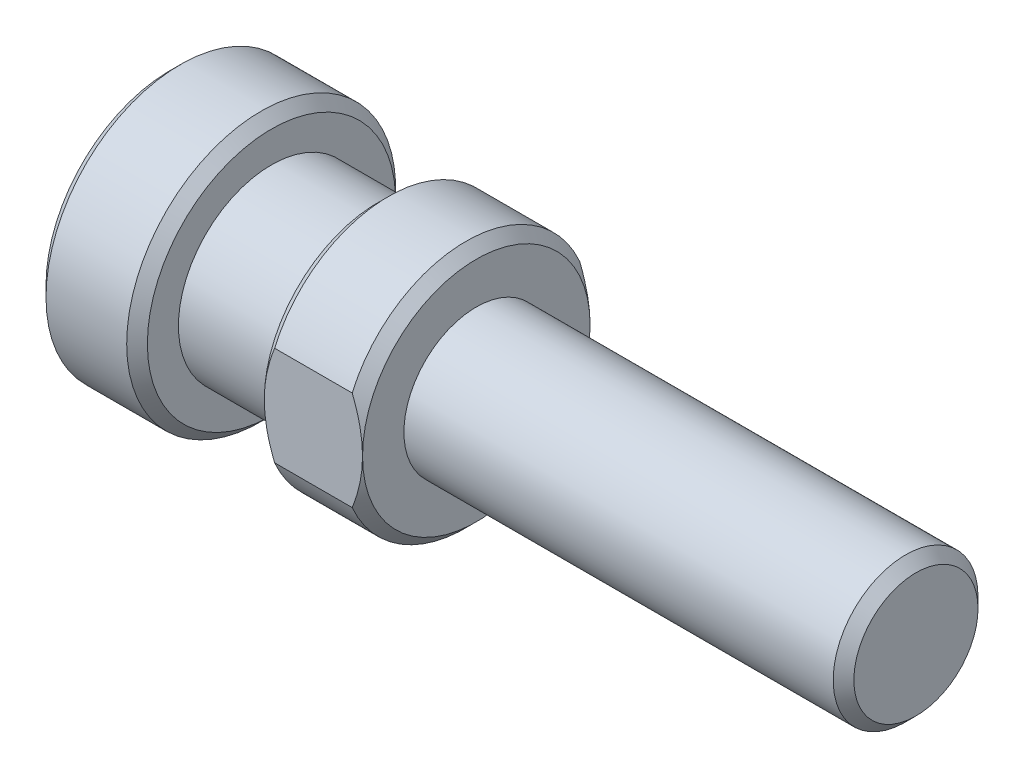
ISO-10303-21;
HEADER;
FILE_DESCRIPTION(('STEP AP214'),'2;1');
FILE_NAME('part.step','',(''),(''),'','','');
FILE_SCHEMA(('AUTOMOTIVE_DESIGN { 1 0 10303 214 1 1 1 1 }'));
ENDSEC;
DATA;
#1=APPLICATION_CONTEXT('core data for automotive mechanical design processes');
#2=APPLICATION_PROTOCOL_DEFINITION('international standard','automotive_design',2000,#1);
#3=PRODUCT_CONTEXT('',#1,'mechanical');
#4=PRODUCT('Part','Part','',(#3));
#5=PRODUCT_RELATED_PRODUCT_CATEGORY('part','',(#4));
#6=PRODUCT_DEFINITION_FORMATION('','',#4);
#7=PRODUCT_DEFINITION_CONTEXT('part definition',#1,'design');
#8=PRODUCT_DEFINITION('design','',#6,#7);
#9=PRODUCT_DEFINITION_SHAPE('','',#8);
#10=(LENGTH_UNIT() NAMED_UNIT(*) SI_UNIT(.MILLI.,.METRE.));
#11=(NAMED_UNIT(*) PLANE_ANGLE_UNIT() SI_UNIT($,.RADIAN.));
#12=(NAMED_UNIT(*) SI_UNIT($,.STERADIAN.) SOLID_ANGLE_UNIT());
#13=UNCERTAINTY_MEASURE_WITH_UNIT(LENGTH_MEASURE(1.E-05),#10,'distance_accuracy_value','');
#14=(GEOMETRIC_REPRESENTATION_CONTEXT(3) GLOBAL_UNCERTAINTY_ASSIGNED_CONTEXT((#13)) GLOBAL_UNIT_ASSIGNED_CONTEXT((#10,
#11,#12)) REPRESENTATION_CONTEXT('',''));
#15=CARTESIAN_POINT('',(0.,0.,0.));
#16=DIRECTION('',(0.,0.,1.));
#17=DIRECTION('',(1.,0.,0.));
#18=AXIS2_PLACEMENT_3D('',#15,#16,#17);
#19=CARTESIAN_POINT('',(9.50000000000001,0.,0.));
#20=DIRECTION('',(-1.,0.,0.));
#21=DIRECTION('',(0.,0.,1.));
#22=AXIS2_PLACEMENT_3D('',#19,#20,#21);
#23=CYLINDRICAL_SURFACE('',#22,12.);
#24=DIRECTION('',(-1.,0.,0.));
#25=VECTOR('',#24,1.);
#26=CARTESIAN_POINT('',(9.50000000000001,4.79583152331262,-11.));
#27=LINE('',#26,#25);
#28=CARTESIAN_POINT('',(8.50000000000001,4.79583152331262,-11.));
#29=VERTEX_POINT('',#28);
#30=CARTESIAN_POINT('',(0.999999999999973,4.79583152331262,-11.0000000000001));
#31=VERTEX_POINT('',#30);
#32=EDGE_CURVE('E105',#29,#31,#27,.T.);
#33=ORIENTED_EDGE('',*,*,#32,.T.);
#34=CARTESIAN_POINT('',(1.,0.,0.));
#35=DIRECTION('',(1.,0.,0.));
#36=DIRECTION('',(0.,0.,-1.));
#37=AXIS2_PLACEMENT_3D('',#34,#35,#36);
#38=CIRCLE('',#37,12.);
#39=CARTESIAN_POINT('',(1.,4.79583152331259,10.9999999999999));
#40=VERTEX_POINT('',#39);
#41=EDGE_CURVE('E184',#31,#40,#38,.T.);
#42=ORIENTED_EDGE('',*,*,#41,.T.);
#43=DIRECTION('',(-1.,0.,0.));
#44=VECTOR('',#43,1.);
#45=CARTESIAN_POINT('',(9.50000000000001,4.79583152331262,11.));
#46=LINE('',#45,#44);
#47=CARTESIAN_POINT('',(8.50000000000001,4.79583152331262,11.));
#48=VERTEX_POINT('',#47);
#49=EDGE_CURVE('E243',#40,#48,#46,.F.);
#50=ORIENTED_EDGE('',*,*,#49,.T.);
#51=CARTESIAN_POINT('',(8.50000000000001,0.,0.));
#52=DIRECTION('',(1.,0.,0.));
#53=DIRECTION('',(0.,0.,-1.));
#54=AXIS2_PLACEMENT_3D('',#51,#52,#53);
#55=CIRCLE('',#54,12.);
#56=EDGE_CURVE('E182',#48,#29,#55,.F.);
#57=ORIENTED_EDGE('',*,*,#56,.T.);
#58=EDGE_LOOP('',(#33,#42,#50,#57));
#59=FACE_BOUND('',#58,.T.);
#60=ADVANCED_FACE('F34',(#59),#23,.T.);
#61=CARTESIAN_POINT('',(0.,0.,0.));
#62=DIRECTION('',(1.,0.,0.));
#63=DIRECTION('',(0.,0.,-1.));
#64=AXIS2_PLACEMENT_3D('',#61,#62,#63);
#65=PLANE('',#64);
#66=CARTESIAN_POINT('',(0.,0.,0.));
#67=DIRECTION('',(1.,0.,0.));
#68=DIRECTION('',(0.,0.,-1.));
#69=AXIS2_PLACEMENT_3D('',#66,#67,#68);
#70=CIRCLE('',#69,11.);
#71=CARTESIAN_POINT('',(0.,-1.11022302462516E-13,10.9999999999999));
#72=VERTEX_POINT('',#71);
#73=CARTESIAN_POINT('',(0.,-1.11022302462516E-13,-11.0000000000001));
#74=VERTEX_POINT('',#73);
#75=EDGE_CURVE('E179',#72,#74,#70,.F.);
#76=ORIENTED_EDGE('',*,*,#75,.T.);
#77=CARTESIAN_POINT('',(0.,0.,0.));
#78=DIRECTION('',(1.,0.,0.));
#79=DIRECTION('',(0.,0.,-1.));
#80=AXIS2_PLACEMENT_3D('',#77,#78,#79);
#81=CIRCLE('',#80,11.);
#82=EDGE_CURVE('E48',#74,#72,#81,.F.);
#83=ORIENTED_EDGE('',*,*,#82,.T.);
#84=EDGE_LOOP('',(#76,#83));
#85=FACE_BOUND('',#84,.T.);
#86=CARTESIAN_POINT('',(0.,0.,0.));
#87=DIRECTION('',(1.,0.,0.));
#88=DIRECTION('',(0.,0.,-1.));
#89=AXIS2_PLACEMENT_3D('',#86,#87,#88);
#90=CIRCLE('',#89,9.);
#91=CARTESIAN_POINT('',(0.,0.,-9.00000000000006));
#92=VERTEX_POINT('',#91);
#93=EDGE_CURVE('E262',#92,#92,#90,.F.);
#94=ORIENTED_EDGE('',*,*,#93,.F.);
#95=EDGE_LOOP('',(#94));
#96=FACE_BOUND('',#95,.T.);
#97=ADVANCED_FACE('F213',(#85,#96),#65,.F.);
#98=CARTESIAN_POINT('',(9.50000000000001,0.,0.));
#99=DIRECTION('',(1.,0.,0.));
#100=DIRECTION('',(0.,0.,-1.));
#101=AXIS2_PLACEMENT_3D('',#98,#99,#100);
#102=PLANE('',#101);
#103=CARTESIAN_POINT('',(9.50000000000001,0.,0.));
#104=DIRECTION('',(1.,0.,0.));
#105=DIRECTION('',(0.,0.,-1.));
#106=AXIS2_PLACEMENT_3D('',#103,#104,#105);
#107=CIRCLE('',#106,11.);
#108=CARTESIAN_POINT('',(9.50000000000001,-1.11022302462516E-13,-11.));
#109=VERTEX_POINT('',#108);
#110=CARTESIAN_POINT('',(9.50000000000001,-1.11022302462516E-13,11.));
#111=VERTEX_POINT('',#110);
#112=EDGE_CURVE('E114',#109,#111,#107,.T.);
#113=ORIENTED_EDGE('',*,*,#112,.T.);
#114=CARTESIAN_POINT('',(9.50000000000001,0.,0.));
#115=DIRECTION('',(1.,0.,0.));
#116=DIRECTION('',(0.,0.,-1.));
#117=AXIS2_PLACEMENT_3D('',#114,#115,#116);
#118=CIRCLE('',#117,11.);
#119=EDGE_CURVE('E93',#111,#109,#118,.T.);
#120=ORIENTED_EDGE('',*,*,#119,.T.);
#121=EDGE_LOOP('',(#113,#120));
#122=FACE_BOUND('',#121,.T.);
#123=CARTESIAN_POINT('',(9.50000000000001,0.,0.));
#124=DIRECTION('',(1.,0.,0.));
#125=DIRECTION('',(0.,0.,-1.));
#126=AXIS2_PLACEMENT_3D('',#123,#124,#125);
#127=CIRCLE('',#126,7.);
#128=CARTESIAN_POINT('',(9.50000000000001,0.,-7.00000000000001));
#129=VERTEX_POINT('',#128);
#130=EDGE_CURVE('E261',#129,#129,#127,.T.);
#131=ORIENTED_EDGE('',*,*,#130,.F.);
#132=EDGE_LOOP('',(#131));
#133=FACE_BOUND('',#132,.T.);
#134=ADVANCED_FACE('F112',(#122,#133),#102,.T.);
#135=DIRECTION('',(-1.,0.,0.));
#136=VECTOR('',#135,1.);
#137=CARTESIAN_POINT('',(9.50000000000001,-4.79583152331284,-11.));
#138=LINE('',#137,#136);
#139=CARTESIAN_POINT('',(0.999999999999973,-4.79583152331284,-11.0000000000001));
#140=VERTEX_POINT('',#139);
#141=CARTESIAN_POINT('',(8.50000000000001,-4.79583152331284,-11.));
#142=VERTEX_POINT('',#141);
#143=EDGE_CURVE('E234',#140,#142,#138,.F.);
#144=ORIENTED_EDGE('',*,*,#143,.T.);
#145=CARTESIAN_POINT('',(8.50000000000001,0.,0.));
#146=DIRECTION('',(1.,0.,0.));
#147=DIRECTION('',(0.,0.,-1.));
#148=AXIS2_PLACEMENT_3D('',#145,#146,#147);
#149=CIRCLE('',#148,12.);
#150=CARTESIAN_POINT('',(8.50000000000001,-4.79583152331284,11.));
#151=VERTEX_POINT('',#150);
#152=EDGE_CURVE('E94',#142,#151,#149,.F.);
#153=ORIENTED_EDGE('',*,*,#152,.T.);
#154=DIRECTION('',(-1.,0.,0.));
#155=VECTOR('',#154,1.);
#156=CARTESIAN_POINT('',(9.50000000000001,-4.79583152331284,11.));
#157=LINE('',#156,#155);
#158=CARTESIAN_POINT('',(1.,-4.79583152331278,10.9999999999999));
#159=VERTEX_POINT('',#158);
#160=EDGE_CURVE('E240',#151,#159,#157,.T.);
#161=ORIENTED_EDGE('',*,*,#160,.T.);
#162=CARTESIAN_POINT('',(1.,0.,0.));
#163=DIRECTION('',(1.,0.,0.));
#164=DIRECTION('',(0.,0.,-1.));
#165=AXIS2_PLACEMENT_3D('',#162,#163,#164);
#166=CIRCLE('',#165,12.);
#167=EDGE_CURVE('E238',#159,#140,#166,.T.);
#168=ORIENTED_EDGE('',*,*,#167,.T.);
#169=EDGE_LOOP('',(#144,#153,#161,#168));
#170=FACE_BOUND('',#169,.T.);
#171=ADVANCED_FACE('F216',(#170),#23,.T.);
#172=CARTESIAN_POINT('',(52.,0.,0.));
#173=DIRECTION('',(-1.,0.,0.));
#174=DIRECTION('',(0.,0.,1.));
#175=AXIS2_PLACEMENT_3D('',#172,#173,#174);
#176=CYLINDRICAL_SURFACE('',#175,7.);
#177=CARTESIAN_POINT('',(51.,0.,0.));
#178=DIRECTION('',(1.,0.,0.));
#179=DIRECTION('',(0.,0.,-1.));
#180=AXIS2_PLACEMENT_3D('',#177,#178,#179);
#181=CIRCLE('',#180,7.);
#182=CARTESIAN_POINT('',(51.,0.,-7.00000000000001));
#183=VERTEX_POINT('',#182);
#184=EDGE_CURVE('E117',#183,#183,#181,.F.);
#185=ORIENTED_EDGE('',*,*,#184,.T.);
#186=EDGE_LOOP('',(#185));
#187=FACE_BOUND('',#186,.T.);
#188=ORIENTED_EDGE('',*,*,#130,.T.);
#189=EDGE_LOOP('',(#188));
#190=FACE_BOUND('',#189,.T.);
#191=ADVANCED_FACE('F223',(#187,#190),#176,.T.);
#192=CARTESIAN_POINT('',(52.,0.,0.));
#193=DIRECTION('',(1.,0.,0.));
#194=DIRECTION('',(0.,0.,-1.));
#195=AXIS2_PLACEMENT_3D('',#192,#193,#194);
#196=PLANE('',#195);
#197=CARTESIAN_POINT('',(52.,0.,0.));
#198=DIRECTION('',(1.,0.,0.));
#199=DIRECTION('',(0.,0.,-1.));
#200=AXIS2_PLACEMENT_3D('',#197,#198,#199);
#201=CIRCLE('',#200,5.99999999999998);
#202=CARTESIAN_POINT('',(52.,0.,-5.99999999999999));
#203=VERTEX_POINT('',#202);
#204=EDGE_CURVE('E120',#203,#203,#201,.T.);
#205=ORIENTED_EDGE('',*,*,#204,.T.);
#206=EDGE_LOOP('',(#205));
#207=FACE_BOUND('',#206,.T.);
#208=ADVANCED_FACE('F229',(#207),#196,.T.);
#209=CARTESIAN_POINT('',(-10.3,0.,0.));
#210=DIRECTION('',(1.,0.,0.));
#211=DIRECTION('',(0.,0.,-1.));
#212=AXIS2_PLACEMENT_3D('',#209,#210,#211);
#213=CYLINDRICAL_SURFACE('',#212,9.);
#214=CARTESIAN_POINT('',(-10.3,0.,0.));
#215=DIRECTION('',(-1.,0.,0.));
#216=DIRECTION('',(0.,0.,1.));
#217=AXIS2_PLACEMENT_3D('',#214,#215,#216);
#218=CIRCLE('',#217,9.);
#219=CARTESIAN_POINT('',(-10.3,0.,-9.00000000000006));
#220=VERTEX_POINT('',#219);
#221=EDGE_CURVE('E263',#220,#220,#218,.T.);
#222=CARTESIAN_POINT('',(-10.3,0.,-9.00000000000006));
#223=CARTESIAN_POINT('',(-10.1927083333333,0.,-9.00000000000006));
#224=CARTESIAN_POINT('',(-10.0854166666667,0.,-9.00000000000006));
#225=CARTESIAN_POINT('',(-9.87083333333334,0.,-9.00000000000006));
#226=CARTESIAN_POINT('',(-9.76354166666667,0.,-9.00000000000006));
#227=CARTESIAN_POINT('',(-9.54895833333334,0.,-9.00000000000006));
#228=CARTESIAN_POINT('',(-9.44166666666667,0.,-9.00000000000006));
#229=CARTESIAN_POINT('',(-9.22708333333334,0.,-9.00000000000006));
#230=CARTESIAN_POINT('',(-9.11979166666667,0.,-9.00000000000006));
#231=CARTESIAN_POINT('',(-8.90520833333334,0.,-9.00000000000006));
#232=CARTESIAN_POINT('',(-8.79791666666667,0.,-9.00000000000006));
#233=CARTESIAN_POINT('',(-8.58333333333334,0.,-9.00000000000006));
#234=CARTESIAN_POINT('',(-8.47604166666667,0.,-9.00000000000006));
#235=CARTESIAN_POINT('',(-8.26145833333334,0.,-9.00000000000006));
#236=CARTESIAN_POINT('',(-8.15416666666667,0.,-9.00000000000006));
#237=CARTESIAN_POINT('',(-7.93958333333334,0.,-9.00000000000006));
#238=CARTESIAN_POINT('',(-7.83229166666667,0.,-9.00000000000006));
#239=CARTESIAN_POINT('',(-7.61770833333334,0.,-9.00000000000006));
#240=CARTESIAN_POINT('',(-7.51041666666667,0.,-9.00000000000006));
#241=CARTESIAN_POINT('',(-7.29583333333334,0.,-9.00000000000006));
#242=CARTESIAN_POINT('',(-7.18854166666667,0.,-9.00000000000006));
#243=CARTESIAN_POINT('',(-6.97395833333334,0.,-9.00000000000006));
#244=CARTESIAN_POINT('',(-6.86666666666667,0.,-9.00000000000006));
#245=CARTESIAN_POINT('',(-6.65208333333334,0.,-9.00000000000006));
#246=CARTESIAN_POINT('',(-6.54479166666667,0.,-9.00000000000006));
#247=CARTESIAN_POINT('',(-6.33020833333334,0.,-9.00000000000006));
#248=CARTESIAN_POINT('',(-6.22291666666667,0.,-9.00000000000006));
#249=CARTESIAN_POINT('',(-6.00833333333334,0.,-9.00000000000006));
#250=CARTESIAN_POINT('',(-5.90104166666667,0.,-9.00000000000006));
#251=CARTESIAN_POINT('',(-5.68645833333334,0.,-9.00000000000006));
#252=CARTESIAN_POINT('',(-5.57916666666667,0.,-9.00000000000006));
#253=CARTESIAN_POINT('',(-5.36458333333334,0.,-9.00000000000006));
#254=CARTESIAN_POINT('',(-5.25729166666667,0.,-9.00000000000006));
#255=CARTESIAN_POINT('',(-5.04270833333334,0.,-9.00000000000006));
#256=CARTESIAN_POINT('',(-4.93541666666667,0.,-9.00000000000006));
#257=CARTESIAN_POINT('',(-4.72083333333334,0.,-9.00000000000006));
#258=CARTESIAN_POINT('',(-4.61354166666667,0.,-9.00000000000006));
#259=CARTESIAN_POINT('',(-4.39895833333334,0.,-9.00000000000006));
#260=CARTESIAN_POINT('',(-4.29166666666667,0.,-9.00000000000006));
#261=CARTESIAN_POINT('',(-4.07708333333334,0.,-9.00000000000006));
#262=CARTESIAN_POINT('',(-3.96979166666667,0.,-9.00000000000006));
#263=CARTESIAN_POINT('',(-3.75520833333334,0.,-9.00000000000006));
#264=CARTESIAN_POINT('',(-3.64791666666667,0.,-9.00000000000006));
#265=CARTESIAN_POINT('',(-3.43333333333334,0.,-9.00000000000006));
#266=CARTESIAN_POINT('',(-3.32604166666667,0.,-9.00000000000006));
#267=CARTESIAN_POINT('',(-3.11145833333334,0.,-9.00000000000006));
#268=CARTESIAN_POINT('',(-3.00416666666667,0.,-9.00000000000006));
#269=CARTESIAN_POINT('',(-2.78958333333334,0.,-9.00000000000006));
#270=CARTESIAN_POINT('',(-2.68229166666667,0.,-9.00000000000006));
#271=CARTESIAN_POINT('',(-2.46770833333334,0.,-9.00000000000006));
#272=CARTESIAN_POINT('',(-2.36041666666667,0.,-9.00000000000006));
#273=CARTESIAN_POINT('',(-2.14583333333334,0.,-9.00000000000006));
#274=CARTESIAN_POINT('',(-2.03854166666667,0.,-9.00000000000006));
#275=CARTESIAN_POINT('',(-1.82395833333334,0.,-9.00000000000006));
#276=CARTESIAN_POINT('',(-1.71666666666667,0.,-9.00000000000006));
#277=CARTESIAN_POINT('',(-1.50208333333334,0.,-9.00000000000006));
#278=CARTESIAN_POINT('',(-1.39479166666667,0.,-9.00000000000006));
#279=CARTESIAN_POINT('',(-1.18020833333334,0.,-9.00000000000006));
#280=CARTESIAN_POINT('',(-1.07291666666667,0.,-9.00000000000006));
#281=CARTESIAN_POINT('',(-0.858333333333336,0.,-9.00000000000006));
#282=CARTESIAN_POINT('',(-0.751041666666669,0.,-9.00000000000006));
#283=CARTESIAN_POINT('',(-0.536458333333336,0.,-9.00000000000006));
#284=CARTESIAN_POINT('',(-0.429166666666669,0.,-9.00000000000006));
#285=CARTESIAN_POINT('',(-0.214583333333336,0.,-9.00000000000006));
#286=CARTESIAN_POINT('',(-0.107291666666669,0.,-9.00000000000006));
#287=CARTESIAN_POINT('',(0.,0.,-9.00000000000006));
#288=B_SPLINE_CURVE_WITH_KNOTS('',3,(#222,#223,#224,#225,#226,#227,#228,#229,#230,#231,#232,
#233,#234,#235,#236,#237,#238,#239,#240,#241,#242,#243,#244,#245,#246,#247,#248,#249,#250,#251,
#252,#253,#254,#255,#256,#257,#258,#259,#260,#261,#262,#263,#264,#265,#266,#267,#268,#269,#270,
#271,#272,#273,#274,#275,#276,#277,#278,#279,#280,#281,#282,#283,#284,#285,#286,#287),
.UNSPECIFIED.,.F.,.F.,(4,2,2,2,2,2,2,2,2,2,2,2,2,2,2,2,2,2,2,2,2,2,2,2,2,2,2,2,2,2,2,2,4),(0.,
0.321875000000001,0.64375,0.965625000000001,1.2875,1.609375,1.93125,2.253125,2.575,2.896875,
3.21875,3.540625,3.8625,4.184375,4.50625,4.828125,5.15,5.471875,5.79375,6.115625,6.4375,
6.759375,7.08125,7.403125,7.725,8.046875,8.36875,8.690625,9.0125,9.334375,9.65625,9.978125,
10.3),.UNSPECIFIED.);
#289=EDGE_CURVE('BSEAM281',#220,#92,#288,.T.);
#290=ORIENTED_EDGE('',*,*,#221,.F.);
#291=ORIENTED_EDGE('',*,*,#93,.T.);
#292=ORIENTED_EDGE('',*,*,#289,.T.);
#293=ORIENTED_EDGE('',*,*,#289,.F.);
#294=EDGE_LOOP('',(#290,#292,#291,#293));
#295=FACE_BOUND('',#294,.T.);
#296=ADVANCED_FACE('F281',(#295),#213,.T.);
#297=CARTESIAN_POINT('',(-10.3,0.,0.));
#298=DIRECTION('',(-1.,0.,0.));
#299=DIRECTION('',(0.,0.,1.));
#300=AXIS2_PLACEMENT_3D('',#297,#298,#299);
#301=PLANE('',#300);
#302=CARTESIAN_POINT('',(-10.3,0.,0.));
#303=DIRECTION('',(-1.,0.,0.));
#304=DIRECTION('',(0.,0.,1.));
#305=AXIS2_PLACEMENT_3D('',#302,#303,#304);
#306=CIRCLE('',#305,12.);
#307=CARTESIAN_POINT('',(-10.3,0.,12.));
#308=VERTEX_POINT('',#307);
#309=EDGE_CURVE('E11',#308,#308,#306,.F.);
#310=ORIENTED_EDGE('',*,*,#309,.T.);
#311=EDGE_LOOP('',(#310));
#312=FACE_BOUND('',#311,.T.);
#313=ORIENTED_EDGE('',*,*,#221,.T.);
#314=EDGE_LOOP('',(#313));
#315=FACE_BOUND('',#314,.T.);
#316=ADVANCED_FACE('F209',(#312,#315),#301,.F.);
#317=CARTESIAN_POINT('',(-20.1,0.,0.));
#318=DIRECTION('',(1.,0.,0.));
#319=DIRECTION('',(0.,0.,-1.));
#320=AXIS2_PLACEMENT_3D('',#317,#318,#319);
#321=CYLINDRICAL_SURFACE('',#320,13.);
#322=CARTESIAN_POINT('',(-19.1,0.,0.));
#323=DIRECTION('',(-1.,0.,0.));
#324=DIRECTION('',(0.,0.,1.));
#325=AXIS2_PLACEMENT_3D('',#322,#323,#324);
#326=CIRCLE('',#325,13.);
#327=CARTESIAN_POINT('',(-19.1,0.,13.));
#328=VERTEX_POINT('',#327);
#329=EDGE_CURVE('E42',#328,#328,#326,.F.);
#330=ORIENTED_EDGE('',*,*,#329,.T.);
#331=EDGE_LOOP('',(#330));
#332=FACE_BOUND('',#331,.T.);
#333=CARTESIAN_POINT('',(-11.3,0.,0.));
#334=DIRECTION('',(-1.,0.,0.));
#335=DIRECTION('',(0.,0.,1.));
#336=AXIS2_PLACEMENT_3D('',#333,#334,#335);
#337=CIRCLE('',#336,13.);
#338=CARTESIAN_POINT('',(-11.3,0.,13.));
#339=VERTEX_POINT('',#338);
#340=EDGE_CURVE('E190',#339,#339,#337,.T.);
#341=ORIENTED_EDGE('',*,*,#340,.T.);
#342=EDGE_LOOP('',(#341));
#343=FACE_BOUND('',#342,.T.);
#344=ADVANCED_FACE('F195',(#332,#343),#321,.T.);
#345=CARTESIAN_POINT('',(-20.1,0.,0.));
#346=DIRECTION('',(-1.,0.,0.));
#347=DIRECTION('',(0.,0.,1.));
#348=AXIS2_PLACEMENT_3D('',#345,#346,#347);
#349=PLANE('',#348);
#350=CARTESIAN_POINT('',(-20.1,0.,0.));
#351=DIRECTION('',(-1.,0.,0.));
#352=DIRECTION('',(0.,0.,1.));
#353=AXIS2_PLACEMENT_3D('',#350,#351,#352);
#354=CIRCLE('',#353,12.);
#355=CARTESIAN_POINT('',(-20.1,0.,12.));
#356=VERTEX_POINT('',#355);
#357=EDGE_CURVE('E187',#356,#356,#354,.T.);
#358=ORIENTED_EDGE('',*,*,#357,.T.);
#359=EDGE_LOOP('',(#358));
#360=FACE_BOUND('',#359,.T.);
#361=ADVANCED_FACE('F203',(#360),#349,.T.);
#362=CARTESIAN_POINT('',(-0.5,4.79583152331259,10.9999999999999));
#363=DIRECTION('',(0.,0.,-1.));
#364=DIRECTION('',(-1.,0.,0.));
#365=AXIS2_PLACEMENT_3D('',#362,#363,#364);
#366=PLANE('',#365);
#367=CARTESIAN_POINT('',(1.,4.79583152331259,10.9999999999999));
#368=CARTESIAN_POINT('',(0.923516274310144,4.60442978760148,10.9999999999999));
#369=CARTESIAN_POINT('',(0.850340905482318,4.41172363708782,10.9999999999999));
#370=CARTESIAN_POINT('',(0.711363126454102,4.02355330016636,10.9999999999999));
#371=CARTESIAN_POINT('',(0.645564896831416,3.82808761988244,10.9999999999999));
#372=CARTESIAN_POINT('',(0.461685730978967,3.24144873091044,10.9999999999999));
#373=CARTESIAN_POINT('',(0.355615273159409,2.84634160064272,10.9999999999999));
#374=CARTESIAN_POINT('',(0.225490309519624,2.24718092916173,10.9999999999999));
#375=CARTESIAN_POINT('',(0.186924474021964,2.04619911758334,10.9999999999999));
#376=CARTESIAN_POINT('',(0.120170923755372,1.64250052972412,10.9999999999999));
#377=CARTESIAN_POINT('',(0.0919828485620717,1.43978381394755,10.9999999999999));
#378=CARTESIAN_POINT('',(0.0463556798777214,1.03125544632614,10.9999999999999));
#379=CARTESIAN_POINT('',(0.0290176016537831,0.8254324643988,10.9999999999999));
#380=CARTESIAN_POINT('',(0.00581641654539763,0.413078888664082,10.9999999999999));
#381=CARTESIAN_POINT('',(-4.31040041753782E-05,0.206548093892763,10.9999999999999));
#382=CARTESIAN_POINT('',(0.,-1.11022302462516E-13,10.9999999999999));
#383=B_SPLINE_CURVE_WITH_KNOTS('',3,(#367,#368,#369,#370,#371,#372,#373,#374,#375,#376,#377,
#378,#379,#380,#381,#382),.UNSPECIFIED.,.F.,.F.,(4,2,2,2,2,2,2,4),(0.,0.618272762458969,
1.23689414386727,2.46220719633099,3.0759359562001,3.6896433989771,4.30898272261357,
4.92851552039944),.UNSPECIFIED.);
#384=EDGE_CURVE('E163',#40,#72,#383,.T.);
#385=ORIENTED_EDGE('',*,*,#384,.T.);
#386=CARTESIAN_POINT('',(0.,-1.11022302462516E-13,10.9999999999999));
#387=CARTESIAN_POINT('',(-1.95225450121407E-05,-0.168721143443187,10.9999999999999));
#388=CARTESIAN_POINT('',(0.00388132058098903,-0.337435646171026,10.9999999999999));
#389=CARTESIAN_POINT('',(0.0193787586777412,-0.674485573464196,10.9999999999999));
#390=CARTESIAN_POINT('',(0.0309741596659091,-0.842821052777738,10.9999999999999));
#391=CARTESIAN_POINT('',(0.0616935884846453,-1.17855675547471,10.9999999999999));
#392=CARTESIAN_POINT('',(0.0808067043846706,-1.34595797933942,10.9999999999999));
#393=CARTESIAN_POINT('',(0.126286735277869,-1.67976491590191,10.9999999999999));
#394=CARTESIAN_POINT('',(0.152653841114996,-1.84617060229057,10.9999999999999));
#395=CARTESIAN_POINT('',(0.241368704880165,-2.33920251976304,10.9999999999999));
#396=CARTESIAN_POINT('',(0.313751662687291,-2.66405989446051,10.9999999999999));
#397=CARTESIAN_POINT('',(0.482279635203406,-3.30745942392153,10.9999999999999));
#398=CARTESIAN_POINT('',(0.57842545675204,-3.62600136385524,10.9999999999999));
#399=CARTESIAN_POINT('',(0.73315169547585,-4.08474664165356,10.9999999999999));
#400=CARTESIAN_POINT('',(0.783719980510562,-4.22771144527471,10.9999999999999));
#401=CARTESIAN_POINT('',(0.888915804109938,-4.5126366646161,10.9999999999999));
#402=CARTESIAN_POINT('',(0.94355524997709,-4.65459268852858,10.9999999999999));
#403=CARTESIAN_POINT('',(0.999999999999973,-4.79583152331278,10.9999999999999));
#404=B_SPLINE_CURVE_WITH_KNOTS('',3,(#386,#387,#388,#389,#390,#391,#392,#393,#394,#395,#396,
#397,#398,#399,#400,#401,#402,#403),.UNSPECIFIED.,.F.,.F.,(4,2,2,2,2,2,2,2,4),(0.,
0.506107340071266,1.01213616463855,1.5174331851291,2.02274350066223,3.02009837906397,
4.01748712611216,4.47237521924325,4.92865035609958),.UNSPECIFIED.);
#405=EDGE_CURVE('E169',#72,#159,#404,.T.);
#406=ORIENTED_EDGE('',*,*,#405,.T.);
#407=ORIENTED_EDGE('',*,*,#160,.F.);
#408=CARTESIAN_POINT('',(8.50000000000001,-4.79583152331284,11.));
#409=CARTESIAN_POINT('',(8.57648372568985,-4.60442978760173,11.));
#410=CARTESIAN_POINT('',(8.64965909451767,-4.41172363708806,10.9999999999999));
#411=CARTESIAN_POINT('',(8.78863687354589,-4.0235533001666,10.9999999999999));
#412=CARTESIAN_POINT('',(8.85443510316858,-3.82808761988268,10.9999999999999));
#413=CARTESIAN_POINT('',(9.03831426902105,-3.24144873091068,10.9999999999999));
#414=CARTESIAN_POINT('',(9.14438472684061,-2.84634160064297,10.9999999999999));
#415=CARTESIAN_POINT('',(9.27450969048041,-2.24718092916197,10.9999999999999));
#416=CARTESIAN_POINT('',(9.31307552597808,-2.04619911758359,10.9999999999999));
#417=CARTESIAN_POINT('',(9.37982907624468,-1.64250052972436,10.9999999999999));
#418=CARTESIAN_POINT('',(9.40801715143798,-1.4397838139478,10.9999999999999));
#419=CARTESIAN_POINT('',(9.45364432012234,-1.03125544632638,10.9999999999999));
#420=CARTESIAN_POINT('',(9.47098239834629,-0.825432464399035,10.9999999999999));
#421=CARTESIAN_POINT('',(9.49418358345467,-0.413078888664312,10.9999999999999));
#422=CARTESIAN_POINT('',(9.50004310400423,-0.206548093892989,11.));
#423=CARTESIAN_POINT('',(9.50000000000001,-1.11022302462516E-13,11.));
#424=B_SPLINE_CURVE_WITH_KNOTS('',3,(#408,#409,#410,#411,#412,#413,#414,#415,#416,#417,#418,
#419,#420,#421,#422,#423),.UNSPECIFIED.,.F.,.F.,(4,2,2,2,2,2,2,4),(0.,0.618272762458971,
1.23689414386727,2.462207196331,3.07593595620012,3.68964339897712,4.3089827226136,
4.92851552039948),.UNSPECIFIED.);
#425=EDGE_CURVE('E170',#151,#111,#424,.T.);
#426=ORIENTED_EDGE('',*,*,#425,.T.);
#427=CARTESIAN_POINT('',(9.50000000000001,-1.11022302462516E-13,11.));
#428=CARTESIAN_POINT('',(9.50001952254507,0.168721143442973,11.));
#429=CARTESIAN_POINT('',(9.49611867941909,0.337435646170819,10.9999999999999));
#430=CARTESIAN_POINT('',(9.48062124132236,0.674485573464001,10.9999999999999));
#431=CARTESIAN_POINT('',(9.46902584033419,0.842821052777548,10.9999999999999));
#432=CARTESIAN_POINT('',(9.43830641151545,1.17855675547451,10.9999999999999));
#433=CARTESIAN_POINT('',(9.41919329561543,1.34595797933922,10.9999999999999));
#434=CARTESIAN_POINT('',(9.37371326472224,1.67976491590169,10.9999999999999));
#435=CARTESIAN_POINT('',(9.34734615888511,1.84617060229034,10.9999999999999));
#436=CARTESIAN_POINT('',(9.25863129511997,2.3392025197628,10.9999999999999));
#437=CARTESIAN_POINT('',(9.18624833731289,2.66405989446028,10.9999999999999));
#438=CARTESIAN_POINT('',(9.01772036479668,3.30745942392127,11.));
#439=CARTESIAN_POINT('',(8.9215745432479,3.62600136385494,11.));
#440=CARTESIAN_POINT('',(8.76684830452418,4.08474664165331,11.));
#441=CARTESIAN_POINT('',(8.71628001948954,4.22771144527451,11.));
#442=CARTESIAN_POINT('',(8.61108419589021,4.51263666461596,10.9999999999999));
#443=CARTESIAN_POINT('',(8.55644475002304,4.65459268852845,10.9999999999999));
#444=CARTESIAN_POINT('',(8.50000000000001,4.79583152331262,11.));
#445=B_SPLINE_CURVE_WITH_KNOTS('',3,(#427,#428,#429,#430,#431,#432,#433,#434,#435,#436,#437,
#438,#439,#440,#441,#442,#443,#444),.UNSPECIFIED.,.F.,.F.,(4,2,2,2,2,2,2,2,4),(0.,
0.506107340071287,1.01213616463858,1.51743318512911,2.02274350066221,3.02009837906394,
4.01748712611213,4.47237521924328,4.92865035609967),.UNSPECIFIED.);
#446=EDGE_CURVE('E56',#111,#48,#445,.T.);
#447=ORIENTED_EDGE('',*,*,#446,.T.);
#448=ORIENTED_EDGE('',*,*,#49,.F.);
#449=EDGE_LOOP('',(#385,#406,#407,#426,#447,#448));
#450=FACE_BOUND('',#449,.T.);
#451=ADVANCED_FACE('F139',(#450),#366,.F.);
#452=CARTESIAN_POINT('',(-0.5,4.79583152331262,-11.0000000000001));
#453=DIRECTION('',(0.,0.,1.));
#454=DIRECTION('',(1.,0.,0.));
#455=AXIS2_PLACEMENT_3D('',#452,#453,#454);
#456=PLANE('',#455);
#457=ORIENTED_EDGE('',*,*,#143,.F.);
#458=CARTESIAN_POINT('',(0.999999999999973,-4.79583152331284,-11.0000000000001));
#459=CARTESIAN_POINT('',(0.923516274310199,-4.6044297876017,-11.0000000000001));
#460=CARTESIAN_POINT('',(0.850340905482406,-4.41172363708803,-11.0000000000001));
#461=CARTESIAN_POINT('',(0.711363126454214,-4.02355330016657,-11.0000000000001));
#462=CARTESIAN_POINT('',(0.645564896831518,-3.82808761988265,-11.0000000000001));
#463=CARTESIAN_POINT('',(0.461685730979048,-3.24144873091066,-11.0000000000001));
#464=CARTESIAN_POINT('',(0.35561527315949,-2.84634160064294,-11.0000000000001));
#465=CARTESIAN_POINT('',(0.225490309519696,-2.24718092916195,-11.0000000000001));
#466=CARTESIAN_POINT('',(0.186924474022031,-2.04619911758356,-11.0000000000001));
#467=CARTESIAN_POINT('',(0.12017092375543,-1.64250052972434,-11.0000000000001));
#468=CARTESIAN_POINT('',(0.0919828485621267,-1.43978381394777,-11.0000000000001));
#469=CARTESIAN_POINT('',(0.0463556798777707,-1.03125544632636,-11.0000000000001));
#470=CARTESIAN_POINT('',(0.0290176016538299,-0.825432464399018,-11.0000000000001));
#471=CARTESIAN_POINT('',(0.0058164165454304,-0.413078888664302,-11.0000000000001));
#472=CARTESIAN_POINT('',(-4.31040041542243E-05,-0.206548093892983,-11.0000000000001));
#473=CARTESIAN_POINT('',(0.,-1.11022302462516E-13,-11.0000000000001));
#474=B_SPLINE_CURVE_WITH_KNOTS('',3,(#458,#459,#460,#461,#462,#463,#464,#465,#466,#467,#468,
#469,#470,#471,#472,#473),.UNSPECIFIED.,.F.,.F.,(4,2,2,2,2,2,2,4),(0.,0.618272762458961,
1.23689414386725,2.46220719633098,3.07593595620009,3.68964339897709,4.30898272261357,
4.92851552039943),.UNSPECIFIED.);
#475=EDGE_CURVE('E149',#140,#74,#474,.T.);
#476=ORIENTED_EDGE('',*,*,#475,.T.);
#477=CARTESIAN_POINT('',(0.,-1.11022302462516E-13,-11.0000000000001));
#478=CARTESIAN_POINT('',(-1.95225449991285E-05,0.168721143442967,-11.0000000000001));
#479=CARTESIAN_POINT('',(0.00388132058100623,0.337435646170809,-11.0000000000001));
#480=CARTESIAN_POINT('',(0.0193787586777585,0.674485573463984,-11.0000000000001));
#481=CARTESIAN_POINT('',(0.0309741596659224,0.842821052777529,-11.0000000000001));
#482=CARTESIAN_POINT('',(0.0616935884846516,1.1785567554745,-11.0000000000001));
#483=CARTESIAN_POINT('',(0.0808067043846736,1.34595797933921,-11.0000000000001));
#484=CARTESIAN_POINT('',(0.126286735277866,1.6797649159017,-11.0000000000001));
#485=CARTESIAN_POINT('',(0.152653841114991,1.84617060229036,-11.0000000000001));
#486=CARTESIAN_POINT('',(0.241368704880146,2.33920251976283,-11.0000000000001));
#487=CARTESIAN_POINT('',(0.313751662687255,2.66405989446031,-11.0000000000001));
#488=CARTESIAN_POINT('',(0.48227963520339,3.30745942392133,-11.0000000000001));
#489=CARTESIAN_POINT('',(0.57842545675206,3.62600136385503,-11.0000000000001));
#490=CARTESIAN_POINT('',(0.733151695475841,4.08474664165337,-11.0000000000001));
#491=CARTESIAN_POINT('',(0.783719980510533,4.22771144527453,-11.0000000000001));
#492=CARTESIAN_POINT('',(0.888915804109893,4.51263666461594,-11.0000000000001));
#493=CARTESIAN_POINT('',(0.943555249977049,4.65459268852842,-11.0000000000001));
#494=CARTESIAN_POINT('',(0.999999999999973,4.79583152331262,-11.0000000000001));
#495=B_SPLINE_CURVE_WITH_KNOTS('',3,(#477,#478,#479,#480,#481,#482,#483,#484,#485,#486,#487,
#488,#489,#490,#491,#492,#493,#494),.UNSPECIFIED.,.F.,.F.,(4,2,2,2,2,2,2,2,4),(0.,
0.506107340071274,1.01213616463856,1.51743318512911,2.02274350066224,3.02009837906399,
4.01748712611218,4.47237521924329,4.92865035609963),.UNSPECIFIED.);
#496=EDGE_CURVE('E98',#74,#31,#495,.T.);
#497=ORIENTED_EDGE('',*,*,#496,.T.);
#498=ORIENTED_EDGE('',*,*,#32,.F.);
#499=CARTESIAN_POINT('',(8.50000000000001,4.79583152331262,-11.));
#500=CARTESIAN_POINT('',(8.57648372568982,4.60442978760149,-11.0000000000001));
#501=CARTESIAN_POINT('',(8.64965909451762,4.41172363708782,-11.0000000000001));
#502=CARTESIAN_POINT('',(8.78863687354582,4.02355330016636,-11.0000000000001));
#503=CARTESIAN_POINT('',(8.85443510316851,3.82808761988244,-11.0000000000001));
#504=CARTESIAN_POINT('',(9.03831426902097,3.24144873091044,-11.0000000000001));
#505=CARTESIAN_POINT('',(9.14438472684053,2.84634160064272,-11.0000000000001));
#506=CARTESIAN_POINT('',(9.27450969048031,2.24718092916173,-11.0000000000001));
#507=CARTESIAN_POINT('',(9.31307552597798,2.04619911758334,-11.0000000000001));
#508=CARTESIAN_POINT('',(9.37982907624457,1.64250052972412,-11.0000000000001));
#509=CARTESIAN_POINT('',(9.40801715143787,1.43978381394755,-11.0000000000001));
#510=CARTESIAN_POINT('',(9.45364432012222,1.03125544632614,-11.0000000000001));
#511=CARTESIAN_POINT('',(9.47098239834615,0.825432464398795,-11.0000000000001));
#512=CARTESIAN_POINT('',(9.49418358345455,0.413078888664079,-11.0000000000001));
#513=CARTESIAN_POINT('',(9.50004310400414,0.206548093892761,-11.0000000000001));
#514=CARTESIAN_POINT('',(9.50000000000001,-1.11022302462516E-13,-11.));
#515=B_SPLINE_CURVE_WITH_KNOTS('',3,(#499,#500,#501,#502,#503,#504,#505,#506,#507,#508,#509,
#510,#511,#512,#513,#514),.UNSPECIFIED.,.F.,.F.,(4,2,2,2,2,2,2,4),(0.,0.618272762458965,
1.23689414386726,2.46220719633099,3.07593595620011,3.6896433989771,4.30898272261358,
4.92851552039944),.UNSPECIFIED.);
#516=EDGE_CURVE('E99',#29,#109,#515,.T.);
#517=ORIENTED_EDGE('',*,*,#516,.T.);
#518=CARTESIAN_POINT('',(9.50000000000001,-1.11022302462516E-13,-11.));
#519=CARTESIAN_POINT('',(9.50001952254498,-0.168721143443181,-11.0000000000001));
#520=CARTESIAN_POINT('',(9.49611867941896,-0.337435646171014,-11.0000000000001));
#521=CARTESIAN_POINT('',(9.4806212413222,-0.674485573464175,-11.0000000000001));
#522=CARTESIAN_POINT('',(9.46902584033404,-0.842821052777713,-11.0000000000001));
#523=CARTESIAN_POINT('',(9.43830641151531,-1.17855675547468,-11.0000000000001));
#524=CARTESIAN_POINT('',(9.41919329561528,-1.34595797933939,-11.0000000000001));
#525=CARTESIAN_POINT('',(9.37371326472208,-1.67976491590189,-11.0000000000001));
#526=CARTESIAN_POINT('',(9.34734615888496,-1.84617060229054,-11.0000000000001));
#527=CARTESIAN_POINT('',(9.25863129511979,-2.33920251976301,-11.0000000000001));
#528=CARTESIAN_POINT('',(9.18624833731265,-2.66405989446048,-11.0000000000001));
#529=CARTESIAN_POINT('',(9.01772036479657,-3.3074594239215,-11.0000000000001));
#530=CARTESIAN_POINT('',(8.92157454324799,-3.62600136385523,-11.0000000000001));
#531=CARTESIAN_POINT('',(8.76684830452414,-4.08474664165354,-11.0000000000001));
#532=CARTESIAN_POINT('',(8.7162800194894,-4.2277114452747,-11.0000000000001));
#533=CARTESIAN_POINT('',(8.61108419589,-4.51263666461611,-11.0000000000001));
#534=CARTESIAN_POINT('',(8.55644475002285,-4.6545926885286,-11.0000000000001));
#535=CARTESIAN_POINT('',(8.50000000000001,-4.79583152331284,-11.));
#536=B_SPLINE_CURVE_WITH_KNOTS('',3,(#518,#519,#520,#521,#522,#523,#524,#525,#526,#527,#528,
#529,#530,#531,#532,#533,#534,#535),.UNSPECIFIED.,.F.,.F.,(4,2,2,2,2,2,2,2,4),(0.,
0.506107340071251,1.01213616463852,1.51743318512907,2.0227435006622,3.02009837906394,
4.01748712611211,4.47237521924325,4.92865035609962),.UNSPECIFIED.);
#537=EDGE_CURVE('E88',#109,#142,#536,.T.);
#538=ORIENTED_EDGE('',*,*,#537,.T.);
#539=EDGE_LOOP('',(#457,#476,#497,#498,#517,#538));
#540=FACE_BOUND('',#539,.T.);
#541=ADVANCED_FACE('F103',(#540),#456,.F.);
#542=CARTESIAN_POINT('',(52.,0.,0.));
#543=DIRECTION('',(-1.,0.,0.));
#544=DIRECTION('',(0.,0.,1.));
#545=AXIS2_PLACEMENT_3D('',#542,#543,#544);
#546=CONICAL_SURFACE('',#545,5.99999999999998,0.785398163397449);
#547=ORIENTED_EDGE('',*,*,#184,.F.);
#548=EDGE_LOOP('',(#547));
#549=FACE_BOUND('',#548,.T.);
#550=ORIENTED_EDGE('',*,*,#204,.F.);
#551=EDGE_LOOP('',(#550));
#552=FACE_BOUND('',#551,.T.);
#553=ADVANCED_FACE('F138',(#549,#552),#546,.T.);
#554=CARTESIAN_POINT('',(9.50000000000001,0.,0.));
#555=DIRECTION('',(-1.,0.,0.));
#556=DIRECTION('',(0.,0.,1.));
#557=AXIS2_PLACEMENT_3D('',#554,#555,#556);
#558=CONICAL_SURFACE('',#557,11.,0.785398163397443);
#559=ORIENTED_EDGE('',*,*,#425,.F.);
#560=ORIENTED_EDGE('',*,*,#152,.F.);
#561=ORIENTED_EDGE('',*,*,#537,.F.);
#562=ORIENTED_EDGE('',*,*,#119,.F.);
#563=EDGE_LOOP('',(#559,#560,#561,#562));
#564=FACE_BOUND('',#563,.T.);
#565=ADVANCED_FACE('F91',(#564),#558,.T.);
#566=CARTESIAN_POINT('',(1.,0.,0.));
#567=DIRECTION('',(1.,0.,0.));
#568=DIRECTION('',(0.,0.,-1.));
#569=AXIS2_PLACEMENT_3D('',#566,#567,#568);
#570=CONICAL_SURFACE('',#569,12.,0.785398163397451);
#571=ORIENTED_EDGE('',*,*,#405,.F.);
#572=ORIENTED_EDGE('',*,*,#82,.F.);
#573=ORIENTED_EDGE('',*,*,#475,.F.);
#574=ORIENTED_EDGE('',*,*,#167,.F.);
#575=EDGE_LOOP('',(#571,#572,#573,#574));
#576=FACE_BOUND('',#575,.T.);
#577=ADVANCED_FACE('F158',(#576),#570,.T.);
#578=CARTESIAN_POINT('',(1.,0.,0.));
#579=DIRECTION('',(1.,0.,0.));
#580=DIRECTION('',(0.,0.,-1.));
#581=AXIS2_PLACEMENT_3D('',#578,#579,#580);
#582=CONICAL_SURFACE('',#581,12.,0.785398163397451);
#583=ORIENTED_EDGE('',*,*,#496,.F.);
#584=ORIENTED_EDGE('',*,*,#75,.F.);
#585=ORIENTED_EDGE('',*,*,#384,.F.);
#586=ORIENTED_EDGE('',*,*,#41,.F.);
#587=EDGE_LOOP('',(#583,#584,#585,#586));
#588=FACE_BOUND('',#587,.T.);
#589=ADVANCED_FACE('F155',(#588),#582,.T.);
#590=CARTESIAN_POINT('',(9.50000000000001,0.,0.));
#591=DIRECTION('',(-1.,0.,0.));
#592=DIRECTION('',(0.,0.,1.));
#593=AXIS2_PLACEMENT_3D('',#590,#591,#592);
#594=CONICAL_SURFACE('',#593,11.,0.785398163397443);
#595=ORIENTED_EDGE('',*,*,#516,.F.);
#596=ORIENTED_EDGE('',*,*,#56,.F.);
#597=ORIENTED_EDGE('',*,*,#446,.F.);
#598=ORIENTED_EDGE('',*,*,#112,.F.);
#599=EDGE_LOOP('',(#595,#596,#597,#598));
#600=FACE_BOUND('',#599,.T.);
#601=ADVANCED_FACE('F116',(#600),#594,.T.);
#602=CARTESIAN_POINT('',(-20.1,0.,0.));
#603=DIRECTION('',(1.,0.,0.));
#604=DIRECTION('',(0.,0.,-1.));
#605=AXIS2_PLACEMENT_3D('',#602,#603,#604);
#606=CONICAL_SURFACE('',#605,12.,0.785398163397447);
#607=ORIENTED_EDGE('',*,*,#329,.F.);
#608=EDGE_LOOP('',(#607));
#609=FACE_BOUND('',#608,.T.);
#610=ORIENTED_EDGE('',*,*,#357,.F.);
#611=EDGE_LOOP('',(#610));
#612=FACE_BOUND('',#611,.T.);
#613=ADVANCED_FACE('F198',(#609,#612),#606,.T.);
#614=CARTESIAN_POINT('',(-11.3,0.,0.));
#615=DIRECTION('',(-1.,0.,0.));
#616=DIRECTION('',(0.,0.,1.));
#617=AXIS2_PLACEMENT_3D('',#614,#615,#616);
#618=CONICAL_SURFACE('',#617,13.,0.785398163397453);
#619=ORIENTED_EDGE('',*,*,#309,.F.);
#620=EDGE_LOOP('',(#619));
#621=FACE_BOUND('',#620,.T.);
#622=ORIENTED_EDGE('',*,*,#340,.F.);
#623=EDGE_LOOP('',(#622));
#624=FACE_BOUND('',#623,.T.);
#625=ADVANCED_FACE('F36',(#621,#624),#618,.T.);
#626=CLOSED_SHELL('',(#60,#97,#134,#171,#191,#208,#296,#316,#344,#361,#451,#541,#553,#565,#577,
#589,#601,#613,#625));
#627=MANIFOLD_SOLID_BREP('B2',#626);
#628=ADVANCED_BREP_SHAPE_REPRESENTATION('',(#18,#627),#14);
#629=SHAPE_DEFINITION_REPRESENTATION(#9,#628);
ENDSEC;
END-ISO-10303-21;
